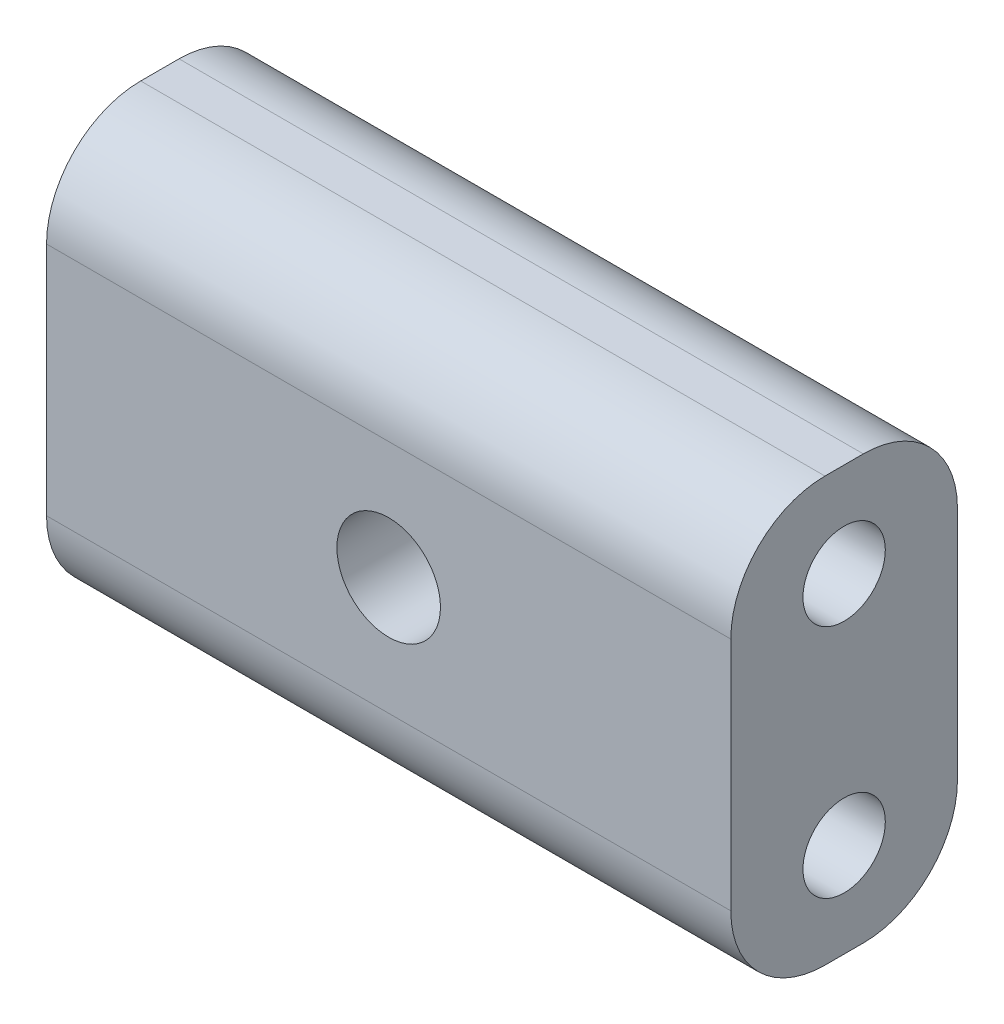
ISO-10303-21;
HEADER;
FILE_DESCRIPTION(('STEP AP214'),'2;1');
FILE_NAME('part.step','',(''),(''),'','','');
FILE_SCHEMA(('AUTOMOTIVE_DESIGN { 1 0 10303 214 1 1 1 1 }'));
ENDSEC;
DATA;
#1=APPLICATION_CONTEXT('core data for automotive mechanical design processes');
#2=APPLICATION_PROTOCOL_DEFINITION('international standard','automotive_design',2000,#1);
#3=PRODUCT_CONTEXT('',#1,'mechanical');
#4=PRODUCT('Part','Part','',(#3));
#5=PRODUCT_RELATED_PRODUCT_CATEGORY('part','',(#4));
#6=PRODUCT_DEFINITION_FORMATION('','',#4);
#7=PRODUCT_DEFINITION_CONTEXT('part definition',#1,'design');
#8=PRODUCT_DEFINITION('design','',#6,#7);
#9=PRODUCT_DEFINITION_SHAPE('','',#8);
#10=(LENGTH_UNIT() NAMED_UNIT(*) SI_UNIT(.MILLI.,.METRE.));
#11=(NAMED_UNIT(*) PLANE_ANGLE_UNIT() SI_UNIT($,.RADIAN.));
#12=(NAMED_UNIT(*) SI_UNIT($,.STERADIAN.) SOLID_ANGLE_UNIT());
#13=UNCERTAINTY_MEASURE_WITH_UNIT(LENGTH_MEASURE(1.E-05),#10,'distance_accuracy_value','');
#14=(GEOMETRIC_REPRESENTATION_CONTEXT(3) GLOBAL_UNCERTAINTY_ASSIGNED_CONTEXT((#13)) GLOBAL_UNIT_ASSIGNED_CONTEXT((#10,
#11,#12)) REPRESENTATION_CONTEXT('',''));
#15=CARTESIAN_POINT('',(0.,0.,0.));
#16=DIRECTION('',(0.,0.,1.));
#17=DIRECTION('',(1.,0.,0.));
#18=AXIS2_PLACEMENT_3D('',#15,#16,#17);
#19=CARTESIAN_POINT('',(14.5375,9.,9.63));
#20=DIRECTION('',(-1.,0.,0.));
#21=DIRECTION('',(0.,0.,1.));
#22=AXIS2_PLACEMENT_3D('',#19,#20,#21);
#23=PLANE('',#22);
#24=CARTESIAN_POINT('',(14.5375,-5.,4.815));
#25=DIRECTION('',(1.,0.,0.));
#26=DIRECTION('',(0.,0.,-1.));
#27=AXIS2_PLACEMENT_3D('',#24,#25,#26);
#28=CIRCLE('',#27,1.75);
#29=CARTESIAN_POINT('',(14.5375,-5.,3.065));
#30=VERTEX_POINT('',#29);
#31=EDGE_CURVE('E367',#30,#30,#28,.T.);
#32=ORIENTED_EDGE('',*,*,#31,.F.);
#33=EDGE_LOOP('',(#32));
#34=FACE_BOUND('',#33,.T.);
#35=CARTESIAN_POINT('',(14.5375,5.,4.815));
#36=DIRECTION('',(1.,0.,0.));
#37=DIRECTION('',(0.,0.,-1.));
#38=AXIS2_PLACEMENT_3D('',#35,#36,#37);
#39=CIRCLE('',#38,1.75);
#40=CARTESIAN_POINT('',(14.5375,5.,3.065));
#41=VERTEX_POINT('',#40);
#42=EDGE_CURVE('E379',#41,#41,#39,.T.);
#43=ORIENTED_EDGE('',*,*,#42,.F.);
#44=EDGE_LOOP('',(#43));
#45=FACE_BOUND('',#44,.T.);
#46=DIRECTION('',(0.,1.,0.));
#47=VECTOR('',#46,1.);
#48=CARTESIAN_POINT('',(14.5375,9.,9.63));
#49=LINE('',#48,#47);
#50=CARTESIAN_POINT('',(14.5375,-5.,9.63));
#51=VERTEX_POINT('',#50);
#52=CARTESIAN_POINT('',(14.5375,5.,9.63));
#53=VERTEX_POINT('',#52);
#54=EDGE_CURVE('E116',#51,#53,#49,.T.);
#55=ORIENTED_EDGE('',*,*,#54,.F.);
#56=CARTESIAN_POINT('',(14.5375,-5.,5.63));
#57=DIRECTION('',(-1.,0.,0.));
#58=DIRECTION('',(0.,0.,1.));
#59=AXIS2_PLACEMENT_3D('',#56,#57,#58);
#60=CIRCLE('',#59,4.);
#61=CARTESIAN_POINT('',(14.5375,-9.,5.63));
#62=VERTEX_POINT('',#61);
#63=EDGE_CURVE('E98',#51,#62,#60,.F.);
#64=ORIENTED_EDGE('',*,*,#63,.T.);
#65=DIRECTION('',(0.,0.,-1.));
#66=VECTOR('',#65,1.);
#67=CARTESIAN_POINT('',(14.5375,-9.,9.63));
#68=LINE('',#67,#66);
#69=CARTESIAN_POINT('',(14.5375,-9.,4.));
#70=VERTEX_POINT('',#69);
#71=EDGE_CURVE('E127',#62,#70,#68,.T.);
#72=ORIENTED_EDGE('',*,*,#71,.T.);
#73=CARTESIAN_POINT('',(14.5375,-5.,4.));
#74=DIRECTION('',(-1.,0.,0.));
#75=DIRECTION('',(0.,0.,1.));
#76=AXIS2_PLACEMENT_3D('',#73,#74,#75);
#77=CIRCLE('',#76,4.);
#78=CARTESIAN_POINT('',(14.5375,-5.,0.));
#79=VERTEX_POINT('',#78);
#80=EDGE_CURVE('E109',#70,#79,#77,.F.);
#81=ORIENTED_EDGE('',*,*,#80,.T.);
#82=DIRECTION('',(0.,1.,0.));
#83=VECTOR('',#82,1.);
#84=CARTESIAN_POINT('',(14.5375,9.,0.));
#85=LINE('',#84,#83);
#86=CARTESIAN_POINT('',(14.5375,5.,0.));
#87=VERTEX_POINT('',#86);
#88=EDGE_CURVE('E130',#79,#87,#85,.T.);
#89=ORIENTED_EDGE('',*,*,#88,.T.);
#90=CARTESIAN_POINT('',(14.5375,5.,4.));
#91=DIRECTION('',(-1.,0.,0.));
#92=DIRECTION('',(0.,0.,1.));
#93=AXIS2_PLACEMENT_3D('',#90,#91,#92);
#94=CIRCLE('',#93,4.);
#95=CARTESIAN_POINT('',(14.5375,9.,4.));
#96=VERTEX_POINT('',#95);
#97=EDGE_CURVE('E119',#87,#96,#94,.F.);
#98=ORIENTED_EDGE('',*,*,#97,.T.);
#99=DIRECTION('',(0.,0.,-1.));
#100=VECTOR('',#99,1.);
#101=CARTESIAN_POINT('',(14.5375,9.,9.63));
#102=LINE('',#101,#100);
#103=CARTESIAN_POINT('',(14.5375,9.,5.63));
#104=VERTEX_POINT('',#103);
#105=EDGE_CURVE('E145',#104,#96,#102,.T.);
#106=ORIENTED_EDGE('',*,*,#105,.F.);
#107=CARTESIAN_POINT('',(14.5375,5.,5.63));
#108=DIRECTION('',(-1.,0.,0.));
#109=DIRECTION('',(0.,0.,1.));
#110=AXIS2_PLACEMENT_3D('',#107,#108,#109);
#111=CIRCLE('',#110,4.);
#112=EDGE_CURVE('E124',#104,#53,#111,.F.);
#113=ORIENTED_EDGE('',*,*,#112,.T.);
#114=EDGE_LOOP('',(#55,#64,#72,#81,#89,#98,#106,#113));
#115=FACE_BOUND('',#114,.T.);
#116=ADVANCED_FACE('F32',(#34,#45,#115),#23,.F.);
#117=CARTESIAN_POINT('',(-14.5375,9.,9.63));
#118=DIRECTION('',(0.,-1.,0.));
#119=DIRECTION('',(0.,0.,-1.));
#120=AXIS2_PLACEMENT_3D('',#117,#118,#119);
#121=PLANE('',#120);
#122=DIRECTION('',(0.,0.,-1.));
#123=VECTOR('',#122,1.);
#124=CARTESIAN_POINT('',(-14.5375,9.,9.63));
#125=LINE('',#124,#123);
#126=CARTESIAN_POINT('',(-14.5375,9.,5.63));
#127=VERTEX_POINT('',#126);
#128=CARTESIAN_POINT('',(-14.5375,9.,4.));
#129=VERTEX_POINT('',#128);
#130=EDGE_CURVE('E143',#127,#129,#125,.T.);
#131=ORIENTED_EDGE('',*,*,#130,.F.);
#132=DIRECTION('',(-1.,0.,0.));
#133=VECTOR('',#132,1.);
#134=CARTESIAN_POINT('',(14.5375,9.,5.63));
#135=LINE('',#134,#133);
#136=EDGE_CURVE('E11',#127,#104,#135,.F.);
#137=ORIENTED_EDGE('',*,*,#136,.T.);
#138=ORIENTED_EDGE('',*,*,#105,.T.);
#139=DIRECTION('',(-1.,0.,0.));
#140=VECTOR('',#139,1.);
#141=CARTESIAN_POINT('',(-14.5375,9.,4.));
#142=LINE('',#141,#140);
#143=EDGE_CURVE('E40',#96,#129,#142,.T.);
#144=ORIENTED_EDGE('',*,*,#143,.T.);
#145=EDGE_LOOP('',(#131,#137,#138,#144));
#146=FACE_BOUND('',#145,.T.);
#147=ADVANCED_FACE('F165',(#146),#121,.F.);
#148=CARTESIAN_POINT('',(-14.5375,9.,9.63));
#149=DIRECTION('',(1.,0.,0.));
#150=DIRECTION('',(0.,0.,-1.));
#151=AXIS2_PLACEMENT_3D('',#148,#149,#150);
#152=PLANE('',#151);
#153=CARTESIAN_POINT('',(-14.5375,5.,4.815));
#154=DIRECTION('',(-1.,0.,0.));
#155=DIRECTION('',(0.,0.,1.));
#156=AXIS2_PLACEMENT_3D('',#153,#154,#155);
#157=CIRCLE('',#156,1.75);
#158=CARTESIAN_POINT('',(-14.5375,5.,6.565));
#159=VERTEX_POINT('',#158);
#160=EDGE_CURVE('E365',#159,#159,#157,.T.);
#161=ORIENTED_EDGE('',*,*,#160,.F.);
#162=EDGE_LOOP('',(#161));
#163=FACE_BOUND('',#162,.T.);
#164=CARTESIAN_POINT('',(-14.5375,-5.,4.815));
#165=DIRECTION('',(-1.,0.,0.));
#166=DIRECTION('',(0.,0.,-1.));
#167=AXIS2_PLACEMENT_3D('',#164,#165,#166);
#168=CIRCLE('',#167,1.75);
#169=CARTESIAN_POINT('',(-14.5375,-5.,3.065));
#170=VERTEX_POINT('',#169);
#171=EDGE_CURVE('E133',#170,#170,#168,.T.);
#172=ORIENTED_EDGE('',*,*,#171,.F.);
#173=EDGE_LOOP('',(#172));
#174=FACE_BOUND('',#173,.T.);
#175=DIRECTION('',(0.,0.,-1.));
#176=VECTOR('',#175,1.);
#177=CARTESIAN_POINT('',(-14.5375,-9.,9.63));
#178=LINE('',#177,#176);
#179=CARTESIAN_POINT('',(-14.5375,-9.,5.63));
#180=VERTEX_POINT('',#179);
#181=CARTESIAN_POINT('',(-14.5375,-9.,4.));
#182=VERTEX_POINT('',#181);
#183=EDGE_CURVE('E140',#180,#182,#178,.T.);
#184=ORIENTED_EDGE('',*,*,#183,.F.);
#185=CARTESIAN_POINT('',(-14.5375,-5.,5.63));
#186=DIRECTION('',(1.,0.,0.));
#187=DIRECTION('',(0.,0.,-1.));
#188=AXIS2_PLACEMENT_3D('',#185,#186,#187);
#189=CIRCLE('',#188,4.);
#190=CARTESIAN_POINT('',(-14.5375,-5.,9.63));
#191=VERTEX_POINT('',#190);
#192=EDGE_CURVE('E159',#180,#191,#189,.F.);
#193=ORIENTED_EDGE('',*,*,#192,.T.);
#194=DIRECTION('',(0.,-1.,0.));
#195=VECTOR('',#194,1.);
#196=CARTESIAN_POINT('',(-14.5375,9.,9.63));
#197=LINE('',#196,#195);
#198=CARTESIAN_POINT('',(-14.5375,5.,9.63));
#199=VERTEX_POINT('',#198);
#200=EDGE_CURVE('E118',#199,#191,#197,.T.);
#201=ORIENTED_EDGE('',*,*,#200,.F.);
#202=CARTESIAN_POINT('',(-14.5375,5.,5.63));
#203=DIRECTION('',(1.,0.,0.));
#204=DIRECTION('',(0.,0.,-1.));
#205=AXIS2_PLACEMENT_3D('',#202,#203,#204);
#206=CIRCLE('',#205,4.);
#207=EDGE_CURVE('E55',#199,#127,#206,.F.);
#208=ORIENTED_EDGE('',*,*,#207,.T.);
#209=ORIENTED_EDGE('',*,*,#130,.T.);
#210=CARTESIAN_POINT('',(-14.5375,5.,4.));
#211=DIRECTION('',(1.,0.,0.));
#212=DIRECTION('',(0.,0.,-1.));
#213=AXIS2_PLACEMENT_3D('',#210,#211,#212);
#214=CIRCLE('',#213,4.);
#215=CARTESIAN_POINT('',(-14.5375,5.,0.));
#216=VERTEX_POINT('',#215);
#217=EDGE_CURVE('E47',#129,#216,#214,.F.);
#218=ORIENTED_EDGE('',*,*,#217,.T.);
#219=DIRECTION('',(0.,-1.,0.));
#220=VECTOR('',#219,1.);
#221=CARTESIAN_POINT('',(-14.5375,9.,0.));
#222=LINE('',#221,#220);
#223=CARTESIAN_POINT('',(-14.5375,-5.,0.));
#224=VERTEX_POINT('',#223);
#225=EDGE_CURVE('E125',#216,#224,#222,.T.);
#226=ORIENTED_EDGE('',*,*,#225,.T.);
#227=CARTESIAN_POINT('',(-14.5375,-5.,4.));
#228=DIRECTION('',(1.,0.,0.));
#229=DIRECTION('',(0.,0.,-1.));
#230=AXIS2_PLACEMENT_3D('',#227,#228,#229);
#231=CIRCLE('',#230,4.);
#232=EDGE_CURVE('E157',#224,#182,#231,.F.);
#233=ORIENTED_EDGE('',*,*,#232,.T.);
#234=EDGE_LOOP('',(#184,#193,#201,#208,#209,#218,#226,#233));
#235=FACE_BOUND('',#234,.T.);
#236=ADVANCED_FACE('F169',(#163,#174,#235),#152,.F.);
#237=CARTESIAN_POINT('',(-14.5375,-9.,9.63));
#238=DIRECTION('',(0.,1.,0.));
#239=DIRECTION('',(0.,0.,1.));
#240=AXIS2_PLACEMENT_3D('',#237,#238,#239);
#241=PLANE('',#240);
#242=ORIENTED_EDGE('',*,*,#71,.F.);
#243=DIRECTION('',(1.,0.,0.));
#244=VECTOR('',#243,1.);
#245=CARTESIAN_POINT('',(-14.5375,-9.,5.63));
#246=LINE('',#245,#244);
#247=EDGE_CURVE('E103',#62,#180,#246,.F.);
#248=ORIENTED_EDGE('',*,*,#247,.T.);
#249=ORIENTED_EDGE('',*,*,#183,.T.);
#250=DIRECTION('',(1.,0.,0.));
#251=VECTOR('',#250,1.);
#252=CARTESIAN_POINT('',(-14.5375,-9.,4.));
#253=LINE('',#252,#251);
#254=EDGE_CURVE('E108',#182,#70,#253,.T.);
#255=ORIENTED_EDGE('',*,*,#254,.T.);
#256=EDGE_LOOP('',(#242,#248,#249,#255));
#257=FACE_BOUND('',#256,.T.);
#258=ADVANCED_FACE('F180',(#257),#241,.F.);
#259=CARTESIAN_POINT('',(0.,0.,9.63));
#260=DIRECTION('',(0.,0.,1.));
#261=DIRECTION('',(1.,0.,0.));
#262=AXIS2_PLACEMENT_3D('',#259,#260,#261);
#263=PLANE('',#262);
#264=CARTESIAN_POINT('',(0.,0.,9.63));
#265=DIRECTION('',(0.,0.,1.));
#266=DIRECTION('',(1.,0.,0.));
#267=AXIS2_PLACEMENT_3D('',#264,#265,#266);
#268=CIRCLE('',#267,2.2);
#269=CARTESIAN_POINT('',(2.2,0.,9.63));
#270=VERTEX_POINT('',#269);
#271=EDGE_CURVE('E374',#270,#270,#268,.F.);
#272=ORIENTED_EDGE('',*,*,#271,.T.);
#273=EDGE_LOOP('',(#272));
#274=FACE_BOUND('',#273,.T.);
#275=ORIENTED_EDGE('',*,*,#200,.T.);
#276=DIRECTION('',(1.,0.,0.));
#277=VECTOR('',#276,1.);
#278=CARTESIAN_POINT('',(14.5375,-5.,9.63));
#279=LINE('',#278,#277);
#280=EDGE_CURVE('E102',#191,#51,#279,.T.);
#281=ORIENTED_EDGE('',*,*,#280,.T.);
#282=ORIENTED_EDGE('',*,*,#54,.T.);
#283=DIRECTION('',(-1.,0.,0.));
#284=VECTOR('',#283,1.);
#285=CARTESIAN_POINT('',(-14.5375,5.,9.63));
#286=LINE('',#285,#284);
#287=EDGE_CURVE('E120',#53,#199,#286,.T.);
#288=ORIENTED_EDGE('',*,*,#287,.T.);
#289=EDGE_LOOP('',(#275,#281,#282,#288));
#290=FACE_BOUND('',#289,.T.);
#291=ADVANCED_FACE('F114',(#274,#290),#263,.T.);
#292=CARTESIAN_POINT('',(0.,0.,0.));
#293=DIRECTION('',(0.,0.,1.));
#294=DIRECTION('',(1.,0.,0.));
#295=AXIS2_PLACEMENT_3D('',#292,#293,#294);
#296=PLANE('',#295);
#297=CARTESIAN_POINT('',(0.,0.,0.));
#298=DIRECTION('',(0.,0.,-1.));
#299=DIRECTION('',(-1.,0.,0.));
#300=AXIS2_PLACEMENT_3D('',#297,#298,#299);
#301=CIRCLE('',#300,2.2);
#302=CARTESIAN_POINT('',(-2.2,0.,0.));
#303=VERTEX_POINT('',#302);
#304=EDGE_CURVE('E391',#303,#303,#301,.T.);
#305=ORIENTED_EDGE('',*,*,#304,.F.);
#306=EDGE_LOOP('',(#305));
#307=FACE_BOUND('',#306,.T.);
#308=ORIENTED_EDGE('',*,*,#88,.F.);
#309=DIRECTION('',(1.,0.,0.));
#310=VECTOR('',#309,1.);
#311=CARTESIAN_POINT('',(0.,-5.,0.));
#312=LINE('',#311,#310);
#313=EDGE_CURVE('E163',#79,#224,#312,.F.);
#314=ORIENTED_EDGE('',*,*,#313,.T.);
#315=ORIENTED_EDGE('',*,*,#225,.F.);
#316=DIRECTION('',(-1.,0.,0.));
#317=VECTOR('',#316,1.);
#318=CARTESIAN_POINT('',(0.,5.,0.));
#319=LINE('',#318,#317);
#320=EDGE_CURVE('E161',#216,#87,#319,.F.);
#321=ORIENTED_EDGE('',*,*,#320,.T.);
#322=EDGE_LOOP('',(#308,#314,#315,#321));
#323=FACE_BOUND('',#322,.T.);
#324=ADVANCED_FACE('F174',(#307,#323),#296,.F.);
#325=CARTESIAN_POINT('',(-6.5375,-5.,4.815));
#326=DIRECTION('',(-1.,0.,0.));
#327=DIRECTION('',(0.,0.,1.));
#328=AXIS2_PLACEMENT_3D('',#325,#326,#327);
#329=CYLINDRICAL_SURFACE('',#328,1.75);
#330=CARTESIAN_POINT('',(-6.5375,-5.,4.815));
#331=DIRECTION('',(-1.,0.,0.));
#332=DIRECTION('',(0.,0.,-1.));
#333=AXIS2_PLACEMENT_3D('',#330,#331,#332);
#334=CIRCLE('',#333,1.75);
#335=CARTESIAN_POINT('',(-6.5375,-5.,3.065));
#336=VERTEX_POINT('',#335);
#337=EDGE_CURVE('E360',#336,#336,#334,.T.);
#338=ORIENTED_EDGE('',*,*,#337,.F.);
#339=EDGE_LOOP('',(#338));
#340=FACE_BOUND('',#339,.T.);
#341=ORIENTED_EDGE('',*,*,#171,.T.);
#342=EDGE_LOOP('',(#341));
#343=FACE_BOUND('',#342,.T.);
#344=ADVANCED_FACE('F241',(#340,#343),#329,.F.);
#345=CARTESIAN_POINT('',(-6.5375,-5.,4.815));
#346=DIRECTION('',(1.,0.,0.));
#347=DIRECTION('',(0.,0.,-1.));
#348=AXIS2_PLACEMENT_3D('',#345,#346,#347);
#349=PLANE('',#348);
#350=ORIENTED_EDGE('',*,*,#337,.T.);
#351=EDGE_LOOP('',(#350));
#352=FACE_BOUND('',#351,.T.);
#353=ADVANCED_FACE('F336',(#352),#349,.F.);
#354=CARTESIAN_POINT('',(-6.5375,5.,4.815));
#355=DIRECTION('',(-1.,0.,0.));
#356=DIRECTION('',(0.,0.,1.));
#357=AXIS2_PLACEMENT_3D('',#354,#355,#356);
#358=CYLINDRICAL_SURFACE('',#357,1.75);
#359=CARTESIAN_POINT('',(-6.5375,5.,4.815));
#360=DIRECTION('',(-1.,0.,0.));
#361=DIRECTION('',(0.,0.,1.));
#362=AXIS2_PLACEMENT_3D('',#359,#360,#361);
#363=CIRCLE('',#362,1.75);
#364=CARTESIAN_POINT('',(-6.5375,5.,6.565));
#365=VERTEX_POINT('',#364);
#366=EDGE_CURVE('E137',#365,#365,#363,.T.);
#367=ORIENTED_EDGE('',*,*,#366,.F.);
#368=EDGE_LOOP('',(#367));
#369=FACE_BOUND('',#368,.T.);
#370=ORIENTED_EDGE('',*,*,#160,.T.);
#371=EDGE_LOOP('',(#370));
#372=FACE_BOUND('',#371,.T.);
#373=ADVANCED_FACE('F326',(#369,#372),#358,.F.);
#374=CARTESIAN_POINT('',(-6.5375,5.,4.815));
#375=DIRECTION('',(-1.,0.,0.));
#376=DIRECTION('',(0.,0.,1.));
#377=AXIS2_PLACEMENT_3D('',#374,#375,#376);
#378=PLANE('',#377);
#379=ORIENTED_EDGE('',*,*,#366,.T.);
#380=EDGE_LOOP('',(#379));
#381=FACE_BOUND('',#380,.T.);
#382=ADVANCED_FACE('F316',(#381),#378,.T.);
#383=CARTESIAN_POINT('',(6.5375,5.,4.815));
#384=DIRECTION('',(1.,0.,0.));
#385=DIRECTION('',(0.,0.,-1.));
#386=AXIS2_PLACEMENT_3D('',#383,#384,#385);
#387=CYLINDRICAL_SURFACE('',#386,1.75);
#388=CARTESIAN_POINT('',(6.5375,5.,4.815));
#389=DIRECTION('',(1.,0.,0.));
#390=DIRECTION('',(0.,0.,-1.));
#391=AXIS2_PLACEMENT_3D('',#388,#389,#390);
#392=CIRCLE('',#391,1.75);
#393=CARTESIAN_POINT('',(6.5375,5.,3.065));
#394=VERTEX_POINT('',#393);
#395=EDGE_CURVE('E371',#394,#394,#392,.T.);
#396=ORIENTED_EDGE('',*,*,#395,.F.);
#397=EDGE_LOOP('',(#396));
#398=FACE_BOUND('',#397,.T.);
#399=ORIENTED_EDGE('',*,*,#42,.T.);
#400=EDGE_LOOP('',(#399));
#401=FACE_BOUND('',#400,.T.);
#402=ADVANCED_FACE('F306',(#398,#401),#387,.F.);
#403=CARTESIAN_POINT('',(6.5375,5.,4.815));
#404=DIRECTION('',(1.,0.,0.));
#405=DIRECTION('',(0.,0.,-1.));
#406=AXIS2_PLACEMENT_3D('',#403,#404,#405);
#407=PLANE('',#406);
#408=ORIENTED_EDGE('',*,*,#395,.T.);
#409=EDGE_LOOP('',(#408));
#410=FACE_BOUND('',#409,.T.);
#411=ADVANCED_FACE('F296',(#410),#407,.T.);
#412=CARTESIAN_POINT('',(6.5375,-5.,4.815));
#413=DIRECTION('',(1.,0.,0.));
#414=DIRECTION('',(0.,0.,-1.));
#415=AXIS2_PLACEMENT_3D('',#412,#413,#414);
#416=CYLINDRICAL_SURFACE('',#415,1.75);
#417=CARTESIAN_POINT('',(6.5375,-5.,4.815));
#418=DIRECTION('',(1.,0.,0.));
#419=DIRECTION('',(0.,0.,-1.));
#420=AXIS2_PLACEMENT_3D('',#417,#418,#419);
#421=CIRCLE('',#420,1.75);
#422=CARTESIAN_POINT('',(6.5375,-5.,3.065));
#423=VERTEX_POINT('',#422);
#424=EDGE_CURVE('E364',#423,#423,#421,.T.);
#425=ORIENTED_EDGE('',*,*,#424,.F.);
#426=EDGE_LOOP('',(#425));
#427=FACE_BOUND('',#426,.T.);
#428=ORIENTED_EDGE('',*,*,#31,.T.);
#429=EDGE_LOOP('',(#428));
#430=FACE_BOUND('',#429,.T.);
#431=ADVANCED_FACE('F286',(#427,#430),#416,.F.);
#432=CARTESIAN_POINT('',(6.5375,-5.,4.815));
#433=DIRECTION('',(1.,0.,0.));
#434=DIRECTION('',(0.,0.,-1.));
#435=AXIS2_PLACEMENT_3D('',#432,#433,#434);
#436=PLANE('',#435);
#437=ORIENTED_EDGE('',*,*,#424,.T.);
#438=EDGE_LOOP('',(#437));
#439=FACE_BOUND('',#438,.T.);
#440=ADVANCED_FACE('F276',(#439),#436,.T.);
#441=CARTESIAN_POINT('',(0.,0.,15.8525396744416));
#442=DIRECTION('',(0.,0.,-1.));
#443=DIRECTION('',(-1.,0.,0.));
#444=AXIS2_PLACEMENT_3D('',#441,#442,#443);
#445=CYLINDRICAL_SURFACE('',#444,2.2);
#446=ORIENTED_EDGE('',*,*,#304,.T.);
#447=EDGE_LOOP('',(#446));
#448=FACE_BOUND('',#447,.T.);
#449=ORIENTED_EDGE('',*,*,#271,.F.);
#450=EDGE_LOOP('',(#449));
#451=FACE_BOUND('',#450,.T.);
#452=ADVANCED_FACE('F204',(#448,#451),#445,.F.);
#453=CARTESIAN_POINT('',(0.,-5.,5.63));
#454=DIRECTION('',(-1.,0.,0.));
#455=DIRECTION('',(0.,0.,1.));
#456=AXIS2_PLACEMENT_3D('',#453,#454,#455);
#457=CYLINDRICAL_SURFACE('',#456,4.);
#458=ORIENTED_EDGE('',*,*,#192,.F.);
#459=ORIENTED_EDGE('',*,*,#247,.F.);
#460=ORIENTED_EDGE('',*,*,#63,.F.);
#461=ORIENTED_EDGE('',*,*,#280,.F.);
#462=EDGE_LOOP('',(#458,#459,#460,#461));
#463=FACE_BOUND('',#462,.T.);
#464=ADVANCED_FACE('F101',(#463),#457,.T.);
#465=CARTESIAN_POINT('',(-14.5375,-5.,4.));
#466=DIRECTION('',(1.,0.,0.));
#467=DIRECTION('',(0.,0.,-1.));
#468=AXIS2_PLACEMENT_3D('',#465,#466,#467);
#469=CYLINDRICAL_SURFACE('',#468,4.);
#470=ORIENTED_EDGE('',*,*,#232,.F.);
#471=ORIENTED_EDGE('',*,*,#313,.F.);
#472=ORIENTED_EDGE('',*,*,#80,.F.);
#473=ORIENTED_EDGE('',*,*,#254,.F.);
#474=EDGE_LOOP('',(#470,#471,#472,#473));
#475=FACE_BOUND('',#474,.T.);
#476=ADVANCED_FACE('F177',(#475),#469,.T.);
#477=CARTESIAN_POINT('',(0.,5.,5.63));
#478=DIRECTION('',(1.,0.,0.));
#479=DIRECTION('',(0.,0.,-1.));
#480=AXIS2_PLACEMENT_3D('',#477,#478,#479);
#481=CYLINDRICAL_SURFACE('',#480,4.);
#482=ORIENTED_EDGE('',*,*,#112,.F.);
#483=ORIENTED_EDGE('',*,*,#136,.F.);
#484=ORIENTED_EDGE('',*,*,#207,.F.);
#485=ORIENTED_EDGE('',*,*,#287,.F.);
#486=EDGE_LOOP('',(#482,#483,#484,#485));
#487=FACE_BOUND('',#486,.T.);
#488=ADVANCED_FACE('F206',(#487),#481,.T.);
#489=CARTESIAN_POINT('',(-14.5375,5.,4.));
#490=DIRECTION('',(-1.,0.,0.));
#491=DIRECTION('',(0.,0.,1.));
#492=AXIS2_PLACEMENT_3D('',#489,#490,#491);
#493=CYLINDRICAL_SURFACE('',#492,4.);
#494=ORIENTED_EDGE('',*,*,#97,.F.);
#495=ORIENTED_EDGE('',*,*,#320,.F.);
#496=ORIENTED_EDGE('',*,*,#217,.F.);
#497=ORIENTED_EDGE('',*,*,#143,.F.);
#498=EDGE_LOOP('',(#494,#495,#496,#497));
#499=FACE_BOUND('',#498,.T.);
#500=ADVANCED_FACE('F34',(#499),#493,.T.);
#501=CLOSED_SHELL('',(#116,#147,#236,#258,#291,#324,#344,#353,#373,#382,#402,#411,#431,#440,
#452,#464,#476,#488,#500));
#502=MANIFOLD_SOLID_BREP('B2',#501);
#503=ADVANCED_BREP_SHAPE_REPRESENTATION('',(#18,#502),#14);
#504=SHAPE_DEFINITION_REPRESENTATION(#9,#503);
ENDSEC;
END-ISO-10303-21;
